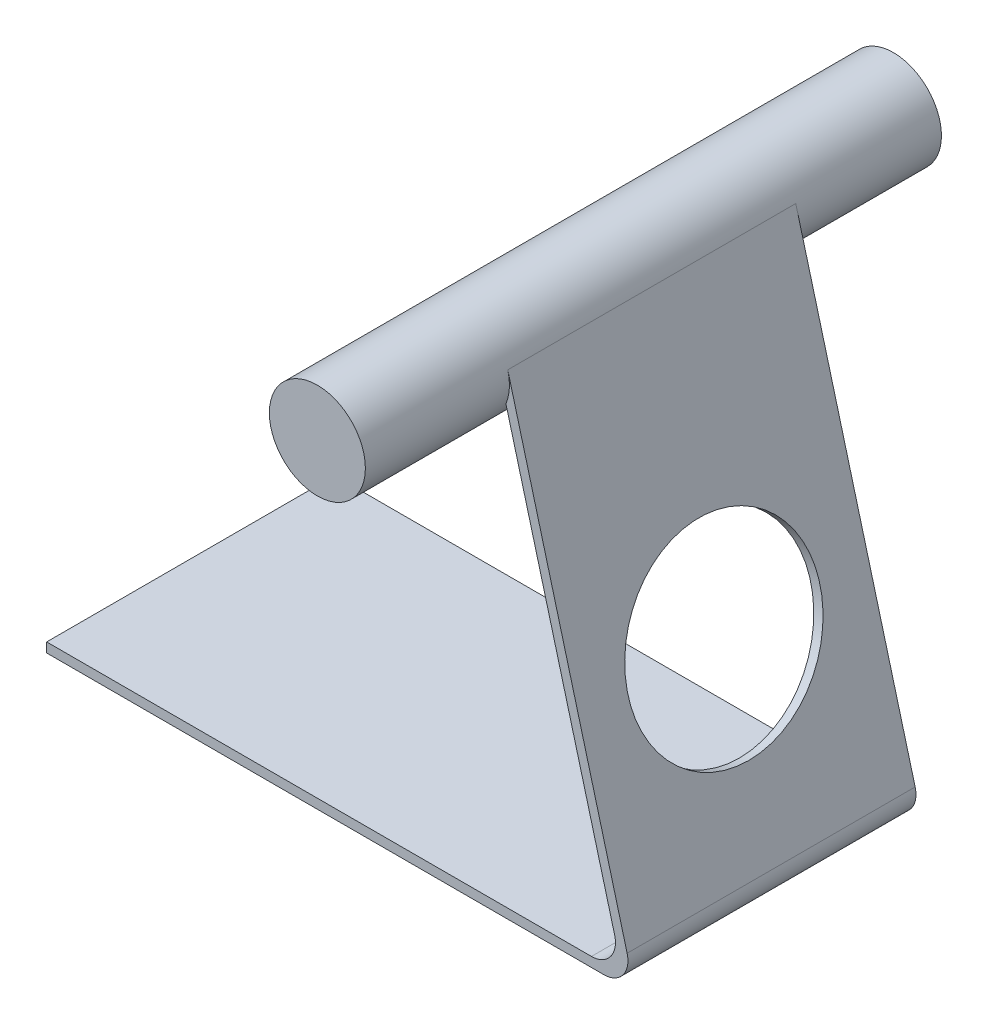
ISO-10303-21;
HEADER;
FILE_DESCRIPTION(('STEP AP214'),'2;1');
FILE_NAME('part.step','',(''),(''),'','','');
FILE_SCHEMA(('AUTOMOTIVE_DESIGN { 1 0 10303 214 1 1 1 1 }'));
ENDSEC;
DATA;
#1=APPLICATION_CONTEXT('core data for automotive mechanical design processes');
#2=APPLICATION_PROTOCOL_DEFINITION('international standard','automotive_design',2000,#1);
#3=PRODUCT_CONTEXT('',#1,'mechanical');
#4=PRODUCT('Part','Part','',(#3));
#5=PRODUCT_RELATED_PRODUCT_CATEGORY('part','',(#4));
#6=PRODUCT_DEFINITION_FORMATION('','',#4);
#7=PRODUCT_DEFINITION_CONTEXT('part definition',#1,'design');
#8=PRODUCT_DEFINITION('design','',#6,#7);
#9=PRODUCT_DEFINITION_SHAPE('','',#8);
#10=(LENGTH_UNIT() NAMED_UNIT(*) SI_UNIT(.MILLI.,.METRE.));
#11=(NAMED_UNIT(*) PLANE_ANGLE_UNIT() SI_UNIT($,.RADIAN.));
#12=(NAMED_UNIT(*) SI_UNIT($,.STERADIAN.) SOLID_ANGLE_UNIT());
#13=UNCERTAINTY_MEASURE_WITH_UNIT(LENGTH_MEASURE(1.E-05),#10,'distance_accuracy_value','');
#14=(GEOMETRIC_REPRESENTATION_CONTEXT(3) GLOBAL_UNCERTAINTY_ASSIGNED_CONTEXT((#13)) GLOBAL_UNIT_ASSIGNED_CONTEXT((#10,
#11,#12)) REPRESENTATION_CONTEXT('',''));
#15=CARTESIAN_POINT('',(0.,0.,0.));
#16=DIRECTION('',(0.,0.,1.));
#17=DIRECTION('',(1.,0.,0.));
#18=AXIS2_PLACEMENT_3D('',#15,#16,#17);
#19=CARTESIAN_POINT('',(0.,0.,0.));
#20=DIRECTION('',(0.,0.,1.));
#21=DIRECTION('',(1.,0.,0.));
#22=AXIS2_PLACEMENT_3D('',#19,#20,#21);
#23=PLANE('',#22);
#24=CARTESIAN_POINT('',(-42.6838251231168,120.04297844047,0.));
#25=DIRECTION('',(0.,0.,-1.));
#26=DIRECTION('',(-1.,0.,0.));
#27=AXIS2_PLACEMENT_3D('',#24,#25,#26);
#28=CIRCLE('',#27,12.7);
#29=CARTESIAN_POINT('',(-30.4165671292457,123.329980313273,0.));
#30=VERTEX_POINT('',#29);
#31=CARTESIAN_POINT('',(-30.8978176043386,115.312225142389,0.));
#32=VERTEX_POINT('',#31);
#33=EDGE_CURVE('E170',#30,#32,#28,.T.);
#34=ORIENTED_EDGE('',*,*,#33,.F.);
#35=DIRECTION('',(0.25881904510255,-0.96592582628906,0.));
#36=VECTOR('',#35,1.);
#37=CARTESIAN_POINT('',(2.45345159877354,0.657400374560295,0.));
#38=LINE('',#37,#36);
#39=CARTESIAN_POINT('',(1.16834032640966,5.45350093640119,0.));
#40=VERTEX_POINT('',#39);
#41=EDGE_CURVE('E154',#30,#40,#38,.T.);
#42=ORIENTED_EDGE('',*,*,#41,.T.);
#43=CARTESIAN_POINT('',(-4.96528867052587,3.81,0.));
#44=DIRECTION('',(0.,0.,1.));
#45=DIRECTION('',(1.,0.,0.));
#46=AXIS2_PLACEMENT_3D('',#43,#44,#45);
#47=CIRCLE('',#46,6.35);
#48=CARTESIAN_POINT('',(-4.96528867052587,-2.54,0.));
#49=VERTEX_POINT('',#48);
#50=EDGE_CURVE('E103',#40,#49,#47,.F.);
#51=ORIENTED_EDGE('',*,*,#50,.T.);
#52=DIRECTION('',(1.,0.,0.));
#53=VECTOR('',#52,1.);
#54=CARTESIAN_POINT('',(0.,-2.54,0.));
#55=LINE('',#54,#53);
#56=CARTESIAN_POINT('',(-152.4,-2.54,0.));
#57=VERTEX_POINT('',#56);
#58=EDGE_CURVE('E164',#57,#49,#55,.T.);
#59=ORIENTED_EDGE('',*,*,#58,.F.);
#60=DIRECTION('',(0.,-1.,0.));
#61=VECTOR('',#60,1.);
#62=CARTESIAN_POINT('',(-152.4,0.,0.));
#63=LINE('',#62,#61);
#64=CARTESIAN_POINT('',(-152.4,0.,0.));
#65=VERTEX_POINT('',#64);
#66=EDGE_CURVE('E195',#65,#57,#63,.T.);
#67=ORIENTED_EDGE('',*,*,#66,.F.);
#68=DIRECTION('',(-1.,0.,0.));
#69=VECTOR('',#68,1.);
#70=CARTESIAN_POINT('',(0.,0.,0.));
#71=LINE('',#70,#69);
#72=CARTESIAN_POINT('',(-8.27548111754163,0.,0.));
#73=VERTEX_POINT('',#72);
#74=EDGE_CURVE('E193',#73,#65,#71,.T.);
#75=ORIENTED_EDGE('',*,*,#74,.F.);
#76=CARTESIAN_POINT('',(-8.27548111754163,6.35,0.));
#77=DIRECTION('',(0.,0.,1.));
#78=DIRECTION('',(1.,0.,0.));
#79=AXIS2_PLACEMENT_3D('',#76,#77,#78);
#80=CIRCLE('',#79,6.35);
#81=CARTESIAN_POINT('',(-2.14185212060604,7.99350093640099,0.));
#82=VERTEX_POINT('',#81);
#83=EDGE_CURVE('E186',#73,#82,#80,.T.);
#84=ORIENTED_EDGE('',*,*,#83,.T.);
#85=DIRECTION('',(-0.258819045102518,0.965925826289069,0.));
#86=VECTOR('',#85,1.);
#87=CARTESIAN_POINT('',(0.,0.,0.));
#88=LINE('',#87,#86);
#89=EDGE_CURVE('E176',#82,#32,#88,.T.);
#90=ORIENTED_EDGE('',*,*,#89,.T.);
#91=EDGE_LOOP('',(#34,#42,#51,#59,#67,#75,#84,#90));
#92=FACE_BOUND('',#91,.T.);
#93=ADVANCED_FACE('F79',(#92),#23,.F.);
#94=CARTESIAN_POINT('',(2.45345159877354,0.657400374560295,76.2));
#95=DIRECTION('',(0.96592582628906,0.25881904510255,0.));
#96=DIRECTION('',(-0.25881904510255,0.965925826289061,0.));
#97=AXIS2_PLACEMENT_3D('',#94,#95,#96);
#98=PLANE('',#97);
#99=CARTESIAN_POINT('',(-11.3371115286179,52.124482630965,38.1));
#100=DIRECTION('',(0.96592582628906,0.25881904510255,0.));
#101=DIRECTION('',(-0.25881904510255,0.965925826289061,0.));
#102=AXIS2_PLACEMENT_3D('',#99,#100,#101);
#103=CIRCLE('',#102,25.4);
#104=CARTESIAN_POINT('',(-4.76310778301316,27.5899666432228,38.1));
#105=VERTEX_POINT('',#104);
#106=EDGE_CURVE('E362',#105,#105,#103,.F.);
#107=ORIENTED_EDGE('',*,*,#106,.T.);
#108=EDGE_LOOP('',(#107));
#109=FACE_BOUND('',#108,.T.);
#110=DIRECTION('',(0.25881904510255,-0.96592582628906,0.));
#111=VECTOR('',#110,1.);
#112=CARTESIAN_POINT('',(2.45345159877354,0.657400374560295,76.2));
#113=LINE('',#112,#111);
#114=CARTESIAN_POINT('',(-30.4165671292456,123.329980313272,76.2));
#115=VERTEX_POINT('',#114);
#116=CARTESIAN_POINT('',(1.16834032640966,5.45350093640119,76.2));
#117=VERTEX_POINT('',#116);
#118=EDGE_CURVE('E152',#115,#117,#113,.T.);
#119=ORIENTED_EDGE('',*,*,#118,.T.);
#120=DIRECTION('',(0.,0.,-1.));
#121=VECTOR('',#120,1.);
#122=CARTESIAN_POINT('',(1.16834032640966,5.45350093640119,0.));
#123=LINE('',#122,#121);
#124=EDGE_CURVE('E190',#117,#40,#123,.T.);
#125=ORIENTED_EDGE('',*,*,#124,.T.);
#126=ORIENTED_EDGE('',*,*,#41,.F.);
#127=DIRECTION('',(0.,0.,-1.));
#128=VECTOR('',#127,1.);
#129=CARTESIAN_POINT('',(-30.4165671292456,123.329980313272,76.2));
#130=LINE('',#129,#128);
#131=EDGE_CURVE('E148',#115,#30,#130,.T.);
#132=ORIENTED_EDGE('',*,*,#131,.F.);
#133=EDGE_LOOP('',(#119,#125,#126,#132));
#134=FACE_BOUND('',#133,.T.);
#135=ADVANCED_FACE('F150',(#109,#134),#98,.T.);
#136=CARTESIAN_POINT('',(0.,0.,76.2));
#137=DIRECTION('',(0.,-1.,0.));
#138=DIRECTION('',(1.,0.,0.));
#139=AXIS2_PLACEMENT_3D('',#136,#137,#138);
#140=PLANE('',#139);
#141=DIRECTION('',(-1.,0.,0.));
#142=VECTOR('',#141,1.);
#143=CARTESIAN_POINT('',(0.,0.,76.2));
#144=LINE('',#143,#142);
#145=CARTESIAN_POINT('',(-8.27548111754163,0.,76.2));
#146=VERTEX_POINT('',#145);
#147=CARTESIAN_POINT('',(-152.4,0.,76.2));
#148=VERTEX_POINT('',#147);
#149=EDGE_CURVE('E163',#146,#148,#144,.T.);
#150=ORIENTED_EDGE('',*,*,#149,.F.);
#151=DIRECTION('',(0.,0.,-1.));
#152=VECTOR('',#151,1.);
#153=CARTESIAN_POINT('',(-8.27548111754163,0.,76.2));
#154=LINE('',#153,#152);
#155=EDGE_CURVE('E180',#146,#73,#154,.T.);
#156=ORIENTED_EDGE('',*,*,#155,.T.);
#157=ORIENTED_EDGE('',*,*,#74,.T.);
#158=DIRECTION('',(0.,0.,-1.));
#159=VECTOR('',#158,1.);
#160=CARTESIAN_POINT('',(-152.4,0.,76.2));
#161=LINE('',#160,#159);
#162=EDGE_CURVE('E184',#148,#65,#161,.T.);
#163=ORIENTED_EDGE('',*,*,#162,.F.);
#164=EDGE_LOOP('',(#150,#156,#157,#163));
#165=FACE_BOUND('',#164,.T.);
#166=ADVANCED_FACE('F235',(#165),#140,.F.);
#167=CARTESIAN_POINT('',(-152.4,0.,76.2));
#168=DIRECTION('',(1.,0.,0.));
#169=DIRECTION('',(0.,0.,-1.));
#170=AXIS2_PLACEMENT_3D('',#167,#168,#169);
#171=PLANE('',#170);
#172=ORIENTED_EDGE('',*,*,#66,.T.);
#173=DIRECTION('',(0.,0.,-1.));
#174=VECTOR('',#173,1.);
#175=CARTESIAN_POINT('',(-152.4,-2.54,76.2));
#176=LINE('',#175,#174);
#177=CARTESIAN_POINT('',(-152.4,-2.54,76.2));
#178=VERTEX_POINT('',#177);
#179=EDGE_CURVE('E203',#178,#57,#176,.T.);
#180=ORIENTED_EDGE('',*,*,#179,.F.);
#181=DIRECTION('',(0.,-1.,0.));
#182=VECTOR('',#181,1.);
#183=CARTESIAN_POINT('',(-152.4,0.,76.2));
#184=LINE('',#183,#182);
#185=EDGE_CURVE('E213',#148,#178,#184,.T.);
#186=ORIENTED_EDGE('',*,*,#185,.F.);
#187=ORIENTED_EDGE('',*,*,#162,.T.);
#188=EDGE_LOOP('',(#172,#180,#186,#187));
#189=FACE_BOUND('',#188,.T.);
#190=ADVANCED_FACE('F211',(#189),#171,.F.);
#191=CARTESIAN_POINT('',(0.,-2.54,76.2));
#192=DIRECTION('',(0.,1.,0.));
#193=DIRECTION('',(-1.,0.,0.));
#194=AXIS2_PLACEMENT_3D('',#191,#192,#193);
#195=PLANE('',#194);
#196=ORIENTED_EDGE('',*,*,#58,.T.);
#197=DIRECTION('',(0.,0.,-1.));
#198=VECTOR('',#197,1.);
#199=CARTESIAN_POINT('',(-4.96528867052587,-2.54,76.2));
#200=LINE('',#199,#198);
#201=CARTESIAN_POINT('',(-4.96528867052587,-2.54,76.2));
#202=VERTEX_POINT('',#201);
#203=EDGE_CURVE('E95',#49,#202,#200,.F.);
#204=ORIENTED_EDGE('',*,*,#203,.T.);
#205=DIRECTION('',(1.,0.,0.));
#206=VECTOR('',#205,1.);
#207=CARTESIAN_POINT('',(0.,-2.54,76.2));
#208=LINE('',#207,#206);
#209=EDGE_CURVE('E198',#178,#202,#208,.T.);
#210=ORIENTED_EDGE('',*,*,#209,.F.);
#211=ORIENTED_EDGE('',*,*,#179,.T.);
#212=EDGE_LOOP('',(#196,#204,#210,#211));
#213=FACE_BOUND('',#212,.T.);
#214=ADVANCED_FACE('F217',(#213),#195,.F.);
#215=CARTESIAN_POINT('',(0.,0.,76.2));
#216=DIRECTION('',(0.,0.,1.));
#217=DIRECTION('',(1.,0.,0.));
#218=AXIS2_PLACEMENT_3D('',#215,#216,#217);
#219=PLANE('',#218);
#220=CARTESIAN_POINT('',(-42.6838251231168,120.04297844047,76.2));
#221=DIRECTION('',(0.,0.,1.));
#222=DIRECTION('',(1.,0.,0.));
#223=AXIS2_PLACEMENT_3D('',#220,#221,#222);
#224=CIRCLE('',#223,12.7);
#225=CARTESIAN_POINT('',(-30.8978176043386,115.312225142389,76.2));
#226=VERTEX_POINT('',#225);
#227=EDGE_CURVE('E12',#226,#115,#224,.T.);
#228=ORIENTED_EDGE('',*,*,#227,.F.);
#229=DIRECTION('',(-0.258819045102518,0.965925826289069,0.));
#230=VECTOR('',#229,1.);
#231=CARTESIAN_POINT('',(0.,0.,76.2));
#232=LINE('',#231,#230);
#233=CARTESIAN_POINT('',(-2.14185212060604,7.99350093640099,76.2));
#234=VERTEX_POINT('',#233);
#235=EDGE_CURVE('E174',#234,#226,#232,.T.);
#236=ORIENTED_EDGE('',*,*,#235,.F.);
#237=CARTESIAN_POINT('',(-8.27548111754163,6.35,76.2));
#238=DIRECTION('',(0.,0.,1.));
#239=DIRECTION('',(1.,0.,0.));
#240=AXIS2_PLACEMENT_3D('',#237,#238,#239);
#241=CIRCLE('',#240,6.35);
#242=EDGE_CURVE('E188',#234,#146,#241,.F.);
#243=ORIENTED_EDGE('',*,*,#242,.T.);
#244=ORIENTED_EDGE('',*,*,#149,.T.);
#245=ORIENTED_EDGE('',*,*,#185,.T.);
#246=ORIENTED_EDGE('',*,*,#209,.T.);
#247=CARTESIAN_POINT('',(-4.96528867052587,3.81,76.2));
#248=DIRECTION('',(0.,0.,1.));
#249=DIRECTION('',(1.,0.,0.));
#250=AXIS2_PLACEMENT_3D('',#247,#248,#249);
#251=CIRCLE('',#250,6.35);
#252=EDGE_CURVE('E83',#202,#117,#251,.T.);
#253=ORIENTED_EDGE('',*,*,#252,.T.);
#254=ORIENTED_EDGE('',*,*,#118,.F.);
#255=EDGE_LOOP('',(#228,#236,#243,#244,#245,#246,#253,#254));
#256=FACE_BOUND('',#255,.T.);
#257=ADVANCED_FACE('F159',(#256),#219,.T.);
#258=CARTESIAN_POINT('',(-42.6838251231168,120.04297844047,76.2));
#259=DIRECTION('',(0.,0.,-1.));
#260=DIRECTION('',(-1.,0.,0.));
#261=AXIS2_PLACEMENT_3D('',#258,#259,#260);
#262=CYLINDRICAL_SURFACE('',#261,12.7);
#263=DIRECTION('',(0.,0.,-1.));
#264=VECTOR('',#263,1.);
#265=CARTESIAN_POINT('',(-30.8978176043386,115.312225142389,76.2));
#266=LINE('',#265,#264);
#267=EDGE_CURVE('E156',#32,#226,#266,.F.);
#268=ORIENTED_EDGE('',*,*,#267,.T.);
#269=ORIENTED_EDGE('',*,*,#227,.T.);
#270=ORIENTED_EDGE('',*,*,#131,.T.);
#271=ORIENTED_EDGE('',*,*,#33,.T.);
#272=EDGE_LOOP('',(#268,#269,#270,#271));
#273=FACE_BOUND('',#272,.T.);
#274=CARTESIAN_POINT('',(-42.6838251231168,120.04297844047,-38.1));
#275=DIRECTION('',(0.,0.,-1.));
#276=DIRECTION('',(-1.,0.,0.));
#277=AXIS2_PLACEMENT_3D('',#274,#275,#276);
#278=CIRCLE('',#277,12.7);
#279=CARTESIAN_POINT('',(-55.3838251231168,120.04297844047,-38.1));
#280=VERTEX_POINT('',#279);
#281=EDGE_CURVE('E358',#280,#280,#278,.T.);
#282=ORIENTED_EDGE('',*,*,#281,.F.);
#283=EDGE_LOOP('',(#282));
#284=FACE_BOUND('',#283,.T.);
#285=CARTESIAN_POINT('',(-42.6838251231168,120.04297844047,114.3));
#286=DIRECTION('',(0.,0.,1.));
#287=DIRECTION('',(1.,0.,0.));
#288=AXIS2_PLACEMENT_3D('',#285,#286,#287);
#289=CIRCLE('',#288,12.7);
#290=CARTESIAN_POINT('',(-29.9838251231168,120.04297844047,114.3));
#291=VERTEX_POINT('',#290);
#292=EDGE_CURVE('E364',#291,#291,#289,.T.);
#293=ORIENTED_EDGE('',*,*,#292,.F.);
#294=EDGE_LOOP('',(#293));
#295=FACE_BOUND('',#294,.T.);
#296=ADVANCED_FACE('F167',(#273,#284,#295),#262,.T.);
#297=CARTESIAN_POINT('',(0.,0.,76.2));
#298=DIRECTION('',(-0.965925826289069,-0.258819045102518,0.));
#299=DIRECTION('',(0.258819045102518,-0.965925826289069,0.));
#300=AXIS2_PLACEMENT_3D('',#297,#298,#299);
#301=PLANE('',#300);
#302=CARTESIAN_POINT('',(-13.7905631273898,51.4670822564052,38.1));
#303=DIRECTION('',(-0.965925826289069,-0.258819045102518,0.));
#304=DIRECTION('',(0.258819045102518,-0.965925826289069,0.));
#305=AXIS2_PLACEMENT_3D('',#302,#303,#304);
#306=CIRCLE('',#305,25.4);
#307=CARTESIAN_POINT('',(-7.21655938178582,26.9325662686629,38.1));
#308=VERTEX_POINT('',#307);
#309=EDGE_CURVE('E359',#308,#308,#306,.F.);
#310=ORIENTED_EDGE('',*,*,#309,.T.);
#311=EDGE_LOOP('',(#310));
#312=FACE_BOUND('',#311,.T.);
#313=ORIENTED_EDGE('',*,*,#89,.F.);
#314=DIRECTION('',(0.,0.,-1.));
#315=VECTOR('',#314,1.);
#316=CARTESIAN_POINT('',(-2.14185212060604,7.99350093640099,76.2));
#317=LINE('',#316,#315);
#318=EDGE_CURVE('E183',#82,#234,#317,.F.);
#319=ORIENTED_EDGE('',*,*,#318,.T.);
#320=ORIENTED_EDGE('',*,*,#235,.T.);
#321=ORIENTED_EDGE('',*,*,#267,.F.);
#322=EDGE_LOOP('',(#313,#319,#320,#321));
#323=FACE_BOUND('',#322,.T.);
#324=ADVANCED_FACE('F228',(#312,#323),#301,.T.);
#325=CARTESIAN_POINT('',(-8.27548111754163,6.35,76.2));
#326=DIRECTION('',(0.,0.,-1.));
#327=DIRECTION('',(-1.,0.,0.));
#328=AXIS2_PLACEMENT_3D('',#325,#326,#327);
#329=CYLINDRICAL_SURFACE('',#328,6.35);
#330=ORIENTED_EDGE('',*,*,#242,.F.);
#331=ORIENTED_EDGE('',*,*,#318,.F.);
#332=ORIENTED_EDGE('',*,*,#83,.F.);
#333=ORIENTED_EDGE('',*,*,#155,.F.);
#334=EDGE_LOOP('',(#330,#331,#332,#333));
#335=FACE_BOUND('',#334,.T.);
#336=ADVANCED_FACE('F220',(#335),#329,.F.);
#337=CARTESIAN_POINT('',(-4.96528867052587,3.81,76.2));
#338=DIRECTION('',(0.,0.,1.));
#339=DIRECTION('',(1.,0.,0.));
#340=AXIS2_PLACEMENT_3D('',#337,#338,#339);
#341=CYLINDRICAL_SURFACE('',#340,6.35);
#342=ORIENTED_EDGE('',*,*,#252,.F.);
#343=ORIENTED_EDGE('',*,*,#203,.F.);
#344=ORIENTED_EDGE('',*,*,#50,.F.);
#345=ORIENTED_EDGE('',*,*,#124,.F.);
#346=EDGE_LOOP('',(#342,#343,#344,#345));
#347=FACE_BOUND('',#346,.T.);
#348=ADVANCED_FACE('F81',(#347),#341,.T.);
#349=CARTESIAN_POINT('',(20.687134741581,60.7053535572801,38.1));
#350=DIRECTION('',(-0.965925826289069,-0.25881904510252,0.));
#351=DIRECTION('',(0.25881904510252,-0.965925826289069,0.));
#352=AXIS2_PLACEMENT_3D('',#349,#350,#351);
#353=CYLINDRICAL_SURFACE('',#352,25.4);
#354=CARTESIAN_POINT('',(-4.76310778301316,27.5899666432228,38.1));
#355=CARTESIAN_POINT('',(-4.78866457050038,27.5831187226545,38.1));
#356=CARTESIAN_POINT('',(-4.8142213579876,27.5762708020862,38.1));
#357=CARTESIAN_POINT('',(-4.86533493296203,27.5625749609495,38.1));
#358=CARTESIAN_POINT('',(-4.89089172044924,27.5557270403812,38.1));
#359=CARTESIAN_POINT('',(-4.94200529542367,27.5420311992445,38.1));
#360=CARTESIAN_POINT('',(-4.96756208291088,27.5351832786762,38.1));
#361=CARTESIAN_POINT('',(-5.01867565788532,27.5214874375395,38.1));
#362=CARTESIAN_POINT('',(-5.04423244537253,27.5146395169712,38.1));
#363=CARTESIAN_POINT('',(-5.09534602034696,27.5009436758345,38.1));
#364=CARTESIAN_POINT('',(-5.12090280783418,27.4940957552662,38.1));
#365=CARTESIAN_POINT('',(-5.1720163828086,27.4803999141295,38.1));
#366=CARTESIAN_POINT('',(-5.19757317029582,27.4735519935612,38.1));
#367=CARTESIAN_POINT('',(-5.24868674527025,27.4598561524245,38.1));
#368=CARTESIAN_POINT('',(-5.27424353275747,27.4530082318562,38.1));
#369=CARTESIAN_POINT('',(-5.3253571077319,27.4393123907195,38.1));
#370=CARTESIAN_POINT('',(-5.35091389521912,27.4324644701512,38.1));
#371=CARTESIAN_POINT('',(-5.40202747019354,27.4187686290145,38.1));
#372=CARTESIAN_POINT('',(-5.42758425768076,27.4119207084462,38.1));
#373=CARTESIAN_POINT('',(-5.47869783265519,27.3982248673095,38.1));
#374=CARTESIAN_POINT('',(-5.50425462014241,27.3913769467412,38.1));
#375=CARTESIAN_POINT('',(-5.55536819511684,27.3776811056045,38.1));
#376=CARTESIAN_POINT('',(-5.58092498260405,27.3708331850362,38.1));
#377=CARTESIAN_POINT('',(-5.63203855757848,27.3571373438995,38.1));
#378=CARTESIAN_POINT('',(-5.65759534506569,27.3502894233312,38.1));
#379=CARTESIAN_POINT('',(-5.70870892004012,27.3365935821945,38.1));
#380=CARTESIAN_POINT('',(-5.73426570752734,27.3297456616262,38.1));
#381=CARTESIAN_POINT('',(-5.78537928250177,27.3160498204895,38.1));
#382=CARTESIAN_POINT('',(-5.81093606998899,27.3092018999212,38.1));
#383=CARTESIAN_POINT('',(-5.86204964496341,27.2955060587845,38.1));
#384=CARTESIAN_POINT('',(-5.88760643245063,27.2886581382162,38.1));
#385=CARTESIAN_POINT('',(-5.93872000742506,27.2749622970795,38.1));
#386=CARTESIAN_POINT('',(-5.96427679491227,27.2681143765112,38.1));
#387=CARTESIAN_POINT('',(-6.01539036988671,27.2544185353745,38.1));
#388=CARTESIAN_POINT('',(-6.04094715737392,27.2475706148062,38.1));
#389=CARTESIAN_POINT('',(-6.09206073234835,27.2338747736695,38.1));
#390=CARTESIAN_POINT('',(-6.11761751983557,27.2270268531012,38.1));
#391=CARTESIAN_POINT('',(-6.16873109480999,27.2133310119645,38.1));
#392=CARTESIAN_POINT('',(-6.19428788229721,27.2064830913962,38.1));
#393=CARTESIAN_POINT('',(-6.24540145727164,27.1927872502595,38.1));
#394=CARTESIAN_POINT('',(-6.27095824475886,27.1859393296912,38.1));
#395=CARTESIAN_POINT('',(-6.32207181973329,27.1722434885545,38.1));
#396=CARTESIAN_POINT('',(-6.3476286072205,27.1653955679862,38.1));
#397=CARTESIAN_POINT('',(-6.39874218219493,27.1516997268495,38.1));
#398=CARTESIAN_POINT('',(-6.42429896968215,27.1448518062812,38.1));
#399=CARTESIAN_POINT('',(-6.47541254465658,27.1311559651445,38.1));
#400=CARTESIAN_POINT('',(-6.5009693321438,27.1243080445762,38.1));
#401=CARTESIAN_POINT('',(-6.55208290711822,27.1106122034395,38.1));
#402=CARTESIAN_POINT('',(-6.57763969460544,27.1037642828712,38.1));
#403=CARTESIAN_POINT('',(-6.62875326957987,27.0900684417345,38.1));
#404=CARTESIAN_POINT('',(-6.65431005706708,27.0832205211662,38.1));
#405=CARTESIAN_POINT('',(-6.70542363204152,27.0695246800295,38.1));
#406=CARTESIAN_POINT('',(-6.73098041952873,27.0626767594612,38.1));
#407=CARTESIAN_POINT('',(-6.78209399450316,27.0489809183245,38.1));
#408=CARTESIAN_POINT('',(-6.80765078199038,27.0421329977562,38.1));
#409=CARTESIAN_POINT('',(-6.85876435696481,27.0284371566195,38.1));
#410=CARTESIAN_POINT('',(-6.88432114445202,27.0215892360512,38.1));
#411=CARTESIAN_POINT('',(-6.93543471942645,27.0078933949145,38.1));
#412=CARTESIAN_POINT('',(-6.96099150691367,27.0010454743462,38.1));
#413=CARTESIAN_POINT('',(-7.0121050818881,26.9873496332095,38.1));
#414=CARTESIAN_POINT('',(-7.03766186937532,26.9805017126412,38.1));
#415=CARTESIAN_POINT('',(-7.08877544434975,26.9668058715045,38.1));
#416=CARTESIAN_POINT('',(-7.11433223183696,26.9599579509362,38.1));
#417=CARTESIAN_POINT('',(-7.16544580681139,26.9462621097995,38.1));
#418=CARTESIAN_POINT('',(-7.1910025942986,26.9394141892312,38.1));
#419=CARTESIAN_POINT('',(-7.21655938178582,26.9325662686629,38.1));
#420=B_SPLINE_CURVE_WITH_KNOTS('',3,(#354,#355,#356,#357,#358,#359,#360,#361,#362,#363,#364,
#365,#366,#367,#368,#369,#370,#371,#372,#373,#374,#375,#376,#377,#378,#379,#380,#381,#382,#383,
#384,#385,#386,#387,#388,#389,#390,#391,#392,#393,#394,#395,#396,#397,#398,#399,#400,#401,#402,
#403,#404,#405,#406,#407,#408,#409,#410,#411,#412,#413,#414,#415,#416,#417,#418,#419),
.UNSPECIFIED.,.F.,.F.,(4,2,2,2,2,2,2,2,2,2,2,2,2,2,2,2,2,2,2,2,2,2,2,2,2,2,2,2,2,2,2,2,4),(0.,
0.079374999999955,0.158749999999897,0.238124999999845,0.317499999999801,0.396874999999742,
0.476249999999691,0.555624999999645,0.634999999999594,0.714374999999542,0.793749999999491,
0.873124999999439,0.952499999999387,1.03187499999934,1.11124999999928,1.19062499999923,
1.26999999999918,1.34937499999914,1.42874999999908,1.50812499999903,1.58749999999898,
1.66687499999892,1.74624999999888,1.82562499999883,1.90499999999877,1.98437499999872,
2.06374999999867,2.14312499999862,2.22249999999857,2.30187499999852,2.38124999999847,
2.46062499999841,2.53999999999836),.UNSPECIFIED.);
#421=EDGE_CURVE('BSEAM219',#105,#308,#420,.T.);
#422=ORIENTED_EDGE('',*,*,#106,.F.);
#423=ORIENTED_EDGE('',*,*,#309,.F.);
#424=ORIENTED_EDGE('',*,*,#421,.T.);
#425=ORIENTED_EDGE('',*,*,#421,.F.);
#426=EDGE_LOOP('',(#422,#424,#423,#425));
#427=FACE_BOUND('',#426,.T.);
#428=ADVANCED_FACE('F219',(#427),#353,.F.);
#429=CARTESIAN_POINT('',(-42.6838251231168,120.04297844047,-38.1));
#430=DIRECTION('',(0.,0.,-1.));
#431=DIRECTION('',(-1.,0.,0.));
#432=AXIS2_PLACEMENT_3D('',#429,#430,#431);
#433=PLANE('',#432);
#434=ORIENTED_EDGE('',*,*,#281,.T.);
#435=EDGE_LOOP('',(#434));
#436=FACE_BOUND('',#435,.T.);
#437=ADVANCED_FACE('F225',(#436),#433,.T.);
#438=CARTESIAN_POINT('',(-42.6838251231168,120.04297844047,114.3));
#439=DIRECTION('',(0.,0.,1.));
#440=DIRECTION('',(1.,0.,0.));
#441=AXIS2_PLACEMENT_3D('',#438,#439,#440);
#442=PLANE('',#441);
#443=ORIENTED_EDGE('',*,*,#292,.T.);
#444=EDGE_LOOP('',(#443));
#445=FACE_BOUND('',#444,.T.);
#446=ADVANCED_FACE('F287',(#445),#442,.T.);
#447=CLOSED_SHELL('',(#93,#135,#166,#190,#214,#257,#296,#324,#336,#348,#428,#437,#446));
#448=MANIFOLD_SOLID_BREP('B2',#447);
#449=ADVANCED_BREP_SHAPE_REPRESENTATION('',(#18,#448),#14);
#450=SHAPE_DEFINITION_REPRESENTATION(#9,#449);
ENDSEC;
END-ISO-10303-21;
